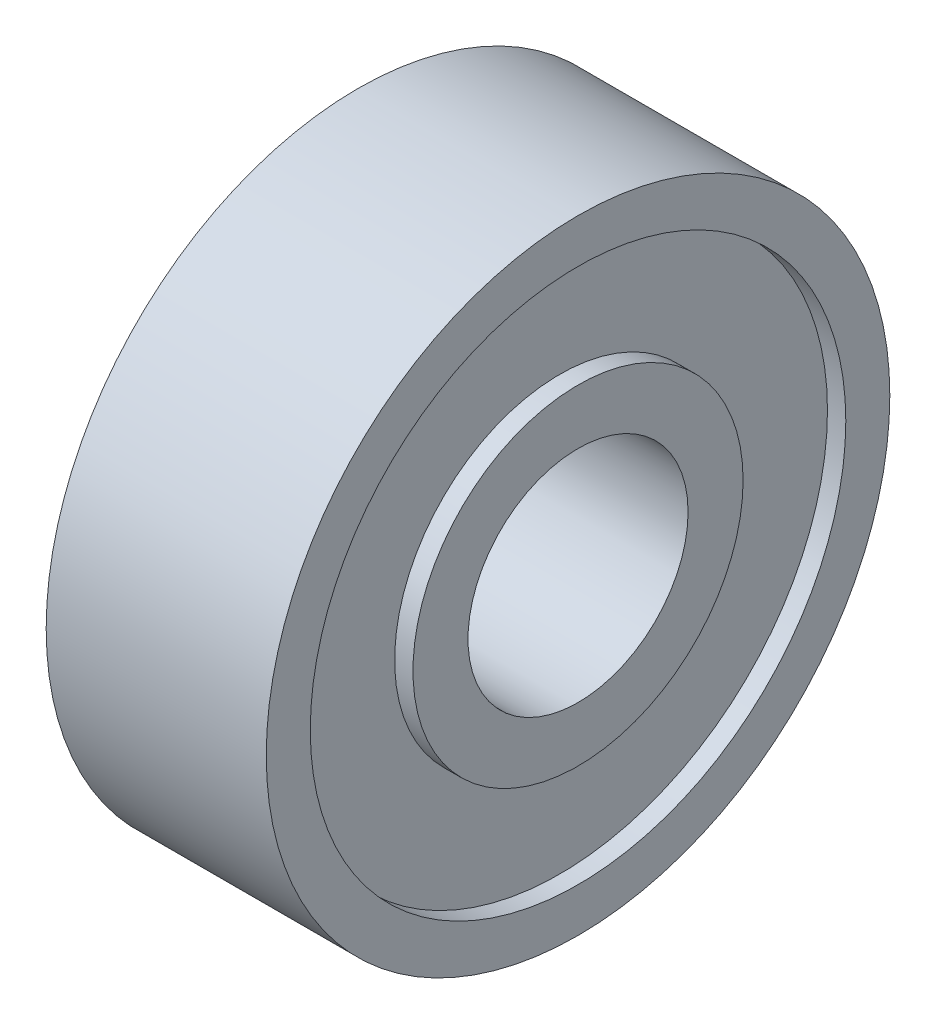
ISO-10303-21;
HEADER;
FILE_DESCRIPTION(('STEP AP214'),'2;1');
FILE_NAME('part.step','',(''),(''),'','','');
FILE_SCHEMA(('AUTOMOTIVE_DESIGN { 1 0 10303 214 1 1 1 1 }'));
ENDSEC;
DATA;
#1=APPLICATION_CONTEXT('core data for automotive mechanical design processes');
#2=APPLICATION_PROTOCOL_DEFINITION('international standard','automotive_design',2000,#1);
#3=PRODUCT_CONTEXT('',#1,'mechanical');
#4=PRODUCT('Part','Part','',(#3));
#5=PRODUCT_RELATED_PRODUCT_CATEGORY('part','',(#4));
#6=PRODUCT_DEFINITION_FORMATION('','',#4);
#7=PRODUCT_DEFINITION_CONTEXT('part definition',#1,'design');
#8=PRODUCT_DEFINITION('design','',#6,#7);
#9=PRODUCT_DEFINITION_SHAPE('','',#8);
#10=(LENGTH_UNIT() NAMED_UNIT(*) SI_UNIT(.MILLI.,.METRE.));
#11=(NAMED_UNIT(*) PLANE_ANGLE_UNIT() SI_UNIT($,.RADIAN.));
#12=(NAMED_UNIT(*) SI_UNIT($,.STERADIAN.) SOLID_ANGLE_UNIT());
#13=UNCERTAINTY_MEASURE_WITH_UNIT(LENGTH_MEASURE(1.E-05),#10,'distance_accuracy_value','');
#14=(GEOMETRIC_REPRESENTATION_CONTEXT(3) GLOBAL_UNCERTAINTY_ASSIGNED_CONTEXT((#13)) GLOBAL_UNIT_ASSIGNED_CONTEXT((#10,
#11,#12)) REPRESENTATION_CONTEXT('',''));
#15=CARTESIAN_POINT('',(0.,0.,0.));
#16=DIRECTION('',(0.,0.,1.));
#17=DIRECTION('',(1.,0.,0.));
#18=AXIS2_PLACEMENT_3D('',#15,#16,#17);
#19=CARTESIAN_POINT('',(3.,0.,0.));
#20=DIRECTION('',(-1.,0.,0.));
#21=DIRECTION('',(0.,0.,1.));
#22=AXIS2_PLACEMENT_3D('',#19,#20,#21);
#23=PLANE('',#22);
#24=CARTESIAN_POINT('',(3.,0.,0.));
#25=DIRECTION('',(1.,0.,0.));
#26=DIRECTION('',(0.,0.,-1.));
#27=AXIS2_PLACEMENT_3D('',#24,#25,#26);
#28=CIRCLE('',#27,7.3);
#29=CARTESIAN_POINT('',(3.,0.,-7.3));
#30=VERTEX_POINT('',#29);
#31=EDGE_CURVE('E90',#30,#30,#28,.T.);
#32=ORIENTED_EDGE('',*,*,#31,.F.);
#33=EDGE_LOOP('',(#32));
#34=FACE_BOUND('',#33,.T.);
#35=CARTESIAN_POINT('',(3.,0.,0.));
#36=DIRECTION('',(1.,0.,0.));
#37=DIRECTION('',(0.,0.,-1.));
#38=AXIS2_PLACEMENT_3D('',#35,#36,#37);
#39=CIRCLE('',#38,8.5);
#40=CARTESIAN_POINT('',(3.,0.,-8.5));
#41=VERTEX_POINT('',#40);
#42=EDGE_CURVE('E10',#41,#41,#39,.T.);
#43=ORIENTED_EDGE('',*,*,#42,.T.);
#44=EDGE_LOOP('',(#43));
#45=FACE_BOUND('',#44,.T.);
#46=ADVANCED_FACE('F39',(#34,#45),#23,.F.);
#47=CARTESIAN_POINT('',(6.7718871685949,0.,0.));
#48=DIRECTION('',(1.,0.,0.));
#49=DIRECTION('',(0.,0.,-1.));
#50=AXIS2_PLACEMENT_3D('',#47,#48,#49);
#51=CYLINDRICAL_SURFACE('',#50,8.5);
#52=CARTESIAN_POINT('',(-3.,0.,0.));
#53=DIRECTION('',(1.,0.,0.));
#54=DIRECTION('',(0.,0.,-1.));
#55=AXIS2_PLACEMENT_3D('',#52,#53,#54);
#56=CIRCLE('',#55,8.5);
#57=CARTESIAN_POINT('',(-3.,0.,-8.5));
#58=VERTEX_POINT('',#57);
#59=EDGE_CURVE('E46',#58,#58,#56,.T.);
#60=ORIENTED_EDGE('',*,*,#59,.T.);
#61=EDGE_LOOP('',(#60));
#62=FACE_BOUND('',#61,.T.);
#63=ORIENTED_EDGE('',*,*,#42,.F.);
#64=EDGE_LOOP('',(#63));
#65=FACE_BOUND('',#64,.T.);
#66=ADVANCED_FACE('F98',(#62,#65),#51,.T.);
#67=CARTESIAN_POINT('',(-3.,0.,0.));
#68=DIRECTION('',(-1.,0.,0.));
#69=DIRECTION('',(0.,0.,1.));
#70=AXIS2_PLACEMENT_3D('',#67,#68,#69);
#71=PLANE('',#70);
#72=CARTESIAN_POINT('',(-3.,0.,0.));
#73=DIRECTION('',(1.,0.,0.));
#74=DIRECTION('',(0.,0.,-1.));
#75=AXIS2_PLACEMENT_3D('',#72,#73,#74);
#76=CIRCLE('',#75,7.3);
#77=CARTESIAN_POINT('',(-3.,0.,-7.3));
#78=VERTEX_POINT('',#77);
#79=EDGE_CURVE('E51',#78,#78,#76,.T.);
#80=ORIENTED_EDGE('',*,*,#79,.T.);
#81=EDGE_LOOP('',(#80));
#82=FACE_BOUND('',#81,.T.);
#83=ORIENTED_EDGE('',*,*,#59,.F.);
#84=EDGE_LOOP('',(#83));
#85=FACE_BOUND('',#84,.T.);
#86=ADVANCED_FACE('F102',(#82,#85),#71,.T.);
#87=CARTESIAN_POINT('',(6.7718871685949,0.,0.));
#88=DIRECTION('',(1.,0.,0.));
#89=DIRECTION('',(0.,0.,-1.));
#90=AXIS2_PLACEMENT_3D('',#87,#88,#89);
#91=CYLINDRICAL_SURFACE('',#90,7.3);
#92=CARTESIAN_POINT('',(-2.5,0.,0.));
#93=DIRECTION('',(1.,0.,0.));
#94=DIRECTION('',(0.,0.,-1.));
#95=AXIS2_PLACEMENT_3D('',#92,#93,#94);
#96=CIRCLE('',#95,7.3);
#97=CARTESIAN_POINT('',(-2.5,0.,-7.3));
#98=VERTEX_POINT('',#97);
#99=EDGE_CURVE('E56',#98,#98,#96,.T.);
#100=ORIENTED_EDGE('',*,*,#99,.T.);
#101=EDGE_LOOP('',(#100));
#102=FACE_BOUND('',#101,.T.);
#103=ORIENTED_EDGE('',*,*,#79,.F.);
#104=EDGE_LOOP('',(#103));
#105=FACE_BOUND('',#104,.T.);
#106=ADVANCED_FACE('F106',(#102,#105),#91,.F.);
#107=CARTESIAN_POINT('',(-2.5,0.,0.));
#108=DIRECTION('',(-1.,0.,0.));
#109=DIRECTION('',(0.,0.,1.));
#110=AXIS2_PLACEMENT_3D('',#107,#108,#109);
#111=PLANE('',#110);
#112=CARTESIAN_POINT('',(-2.5,0.,0.));
#113=DIRECTION('',(1.,0.,0.));
#114=DIRECTION('',(0.,0.,-1.));
#115=AXIS2_PLACEMENT_3D('',#112,#113,#114);
#116=CIRCLE('',#115,4.5);
#117=CARTESIAN_POINT('',(-2.5,0.,-4.5));
#118=VERTEX_POINT('',#117);
#119=EDGE_CURVE('E62',#118,#118,#116,.T.);
#120=ORIENTED_EDGE('',*,*,#119,.T.);
#121=EDGE_LOOP('',(#120));
#122=FACE_BOUND('',#121,.T.);
#123=ORIENTED_EDGE('',*,*,#99,.F.);
#124=EDGE_LOOP('',(#123));
#125=FACE_BOUND('',#124,.T.);
#126=ADVANCED_FACE('F113',(#122,#125),#111,.T.);
#127=CARTESIAN_POINT('',(6.7718871685949,0.,0.));
#128=DIRECTION('',(1.,0.,0.));
#129=DIRECTION('',(0.,0.,-1.));
#130=AXIS2_PLACEMENT_3D('',#127,#128,#129);
#131=CYLINDRICAL_SURFACE('',#130,4.5);
#132=CARTESIAN_POINT('',(-3.,0.,0.));
#133=DIRECTION('',(1.,0.,0.));
#134=DIRECTION('',(0.,0.,-1.));
#135=AXIS2_PLACEMENT_3D('',#132,#133,#134);
#136=CIRCLE('',#135,4.5);
#137=CARTESIAN_POINT('',(-3.,0.,-4.5));
#138=VERTEX_POINT('',#137);
#139=EDGE_CURVE('E66',#138,#138,#136,.T.);
#140=ORIENTED_EDGE('',*,*,#139,.T.);
#141=EDGE_LOOP('',(#140));
#142=FACE_BOUND('',#141,.T.);
#143=ORIENTED_EDGE('',*,*,#119,.F.);
#144=EDGE_LOOP('',(#143));
#145=FACE_BOUND('',#144,.T.);
#146=ADVANCED_FACE('F117',(#142,#145),#131,.T.);
#147=CARTESIAN_POINT('',(-3.,0.,0.));
#148=DIRECTION('',(-1.,0.,0.));
#149=DIRECTION('',(0.,0.,1.));
#150=AXIS2_PLACEMENT_3D('',#147,#148,#149);
#151=PLANE('',#150);
#152=CARTESIAN_POINT('',(-3.,0.,0.));
#153=DIRECTION('',(1.,0.,0.));
#154=DIRECTION('',(0.,0.,-1.));
#155=AXIS2_PLACEMENT_3D('',#152,#153,#154);
#156=CIRCLE('',#155,3.);
#157=CARTESIAN_POINT('',(-3.,0.,-3.));
#158=VERTEX_POINT('',#157);
#159=EDGE_CURVE('E70',#158,#158,#156,.T.);
#160=ORIENTED_EDGE('',*,*,#159,.T.);
#161=EDGE_LOOP('',(#160));
#162=FACE_BOUND('',#161,.T.);
#163=ORIENTED_EDGE('',*,*,#139,.F.);
#164=EDGE_LOOP('',(#163));
#165=FACE_BOUND('',#164,.T.);
#166=ADVANCED_FACE('F121',(#162,#165),#151,.T.);
#167=CARTESIAN_POINT('',(6.7718871685949,0.,0.));
#168=DIRECTION('',(1.,0.,0.));
#169=DIRECTION('',(0.,0.,-1.));
#170=AXIS2_PLACEMENT_3D('',#167,#168,#169);
#171=CYLINDRICAL_SURFACE('',#170,3.);
#172=CARTESIAN_POINT('',(3.,0.,0.));
#173=DIRECTION('',(1.,0.,0.));
#174=DIRECTION('',(0.,0.,-1.));
#175=AXIS2_PLACEMENT_3D('',#172,#173,#174);
#176=CIRCLE('',#175,3.);
#177=CARTESIAN_POINT('',(3.,0.,-3.));
#178=VERTEX_POINT('',#177);
#179=EDGE_CURVE('E74',#178,#178,#176,.T.);
#180=ORIENTED_EDGE('',*,*,#179,.T.);
#181=EDGE_LOOP('',(#180));
#182=FACE_BOUND('',#181,.T.);
#183=ORIENTED_EDGE('',*,*,#159,.F.);
#184=EDGE_LOOP('',(#183));
#185=FACE_BOUND('',#184,.T.);
#186=ADVANCED_FACE('F125',(#182,#185),#171,.F.);
#187=CARTESIAN_POINT('',(3.,0.,0.));
#188=DIRECTION('',(-1.,0.,0.));
#189=DIRECTION('',(0.,0.,1.));
#190=AXIS2_PLACEMENT_3D('',#187,#188,#189);
#191=PLANE('',#190);
#192=ORIENTED_EDGE('',*,*,#179,.F.);
#193=EDGE_LOOP('',(#192));
#194=FACE_BOUND('',#193,.T.);
#195=CARTESIAN_POINT('',(3.,0.,0.));
#196=DIRECTION('',(1.,0.,0.));
#197=DIRECTION('',(0.,0.,-1.));
#198=AXIS2_PLACEMENT_3D('',#195,#196,#197);
#199=CIRCLE('',#198,4.5);
#200=CARTESIAN_POINT('',(3.,0.,-4.5));
#201=VERTEX_POINT('',#200);
#202=EDGE_CURVE('E78',#201,#201,#199,.T.);
#203=ORIENTED_EDGE('',*,*,#202,.T.);
#204=EDGE_LOOP('',(#203));
#205=FACE_BOUND('',#204,.T.);
#206=ADVANCED_FACE('F129',(#194,#205),#191,.F.);
#207=CARTESIAN_POINT('',(6.7718871685949,0.,0.));
#208=DIRECTION('',(1.,0.,0.));
#209=DIRECTION('',(0.,0.,-1.));
#210=AXIS2_PLACEMENT_3D('',#207,#208,#209);
#211=CYLINDRICAL_SURFACE('',#210,4.5);
#212=ORIENTED_EDGE('',*,*,#202,.F.);
#213=EDGE_LOOP('',(#212));
#214=FACE_BOUND('',#213,.T.);
#215=CARTESIAN_POINT('',(2.5,0.,0.));
#216=DIRECTION('',(1.,0.,0.));
#217=DIRECTION('',(0.,0.,-1.));
#218=AXIS2_PLACEMENT_3D('',#215,#216,#217);
#219=CIRCLE('',#218,4.5);
#220=CARTESIAN_POINT('',(2.5,0.,-4.5));
#221=VERTEX_POINT('',#220);
#222=EDGE_CURVE('E82',#221,#221,#219,.T.);
#223=ORIENTED_EDGE('',*,*,#222,.T.);
#224=EDGE_LOOP('',(#223));
#225=FACE_BOUND('',#224,.T.);
#226=ADVANCED_FACE('F133',(#214,#225),#211,.T.);
#227=CARTESIAN_POINT('',(2.5,0.,0.));
#228=DIRECTION('',(-1.,0.,0.));
#229=DIRECTION('',(0.,0.,1.));
#230=AXIS2_PLACEMENT_3D('',#227,#228,#229);
#231=PLANE('',#230);
#232=ORIENTED_EDGE('',*,*,#222,.F.);
#233=EDGE_LOOP('',(#232));
#234=FACE_BOUND('',#233,.T.);
#235=CARTESIAN_POINT('',(2.5,0.,0.));
#236=DIRECTION('',(1.,0.,0.));
#237=DIRECTION('',(0.,0.,-1.));
#238=AXIS2_PLACEMENT_3D('',#235,#236,#237);
#239=CIRCLE('',#238,7.3);
#240=CARTESIAN_POINT('',(2.5,0.,-7.3));
#241=VERTEX_POINT('',#240);
#242=EDGE_CURVE('E86',#241,#241,#239,.T.);
#243=ORIENTED_EDGE('',*,*,#242,.T.);
#244=EDGE_LOOP('',(#243));
#245=FACE_BOUND('',#244,.T.);
#246=ADVANCED_FACE('F137',(#234,#245),#231,.F.);
#247=CARTESIAN_POINT('',(6.7718871685949,0.,0.));
#248=DIRECTION('',(1.,0.,0.));
#249=DIRECTION('',(0.,0.,-1.));
#250=AXIS2_PLACEMENT_3D('',#247,#248,#249);
#251=CYLINDRICAL_SURFACE('',#250,7.3);
#252=ORIENTED_EDGE('',*,*,#242,.F.);
#253=EDGE_LOOP('',(#252));
#254=FACE_BOUND('',#253,.T.);
#255=ORIENTED_EDGE('',*,*,#31,.T.);
#256=EDGE_LOOP('',(#255));
#257=FACE_BOUND('',#256,.T.);
#258=ADVANCED_FACE('F95',(#254,#257),#251,.F.);
#259=CLOSED_SHELL('',(#46,#66,#86,#106,#126,#146,#166,#186,#206,#226,#246,#258));
#260=MANIFOLD_SOLID_BREP('B2',#259);
#261=ADVANCED_BREP_SHAPE_REPRESENTATION('',(#18,#260),#14);
#262=SHAPE_DEFINITION_REPRESENTATION(#9,#261);
ENDSEC;
END-ISO-10303-21;
